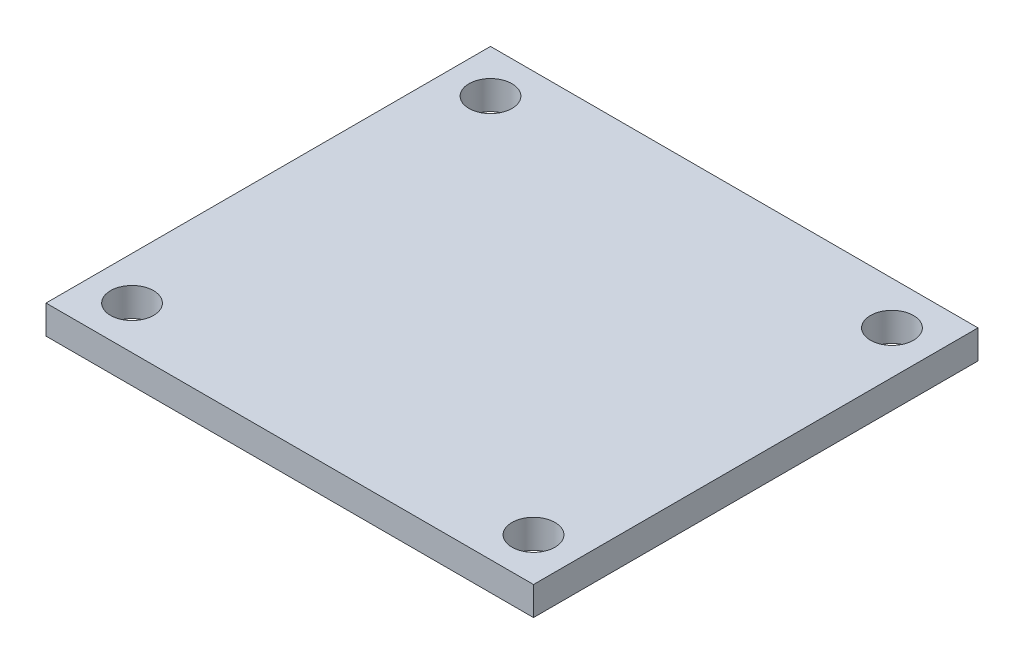
ISO-10303-21;
HEADER;
FILE_DESCRIPTION(('STEP AP214'),'2;1');
FILE_NAME('part.step','',(''),(''),'','','');
FILE_SCHEMA(('AUTOMOTIVE_DESIGN { 1 0 10303 214 1 1 1 1 }'));
ENDSEC;
DATA;
#1=APPLICATION_CONTEXT('core data for automotive mechanical design processes');
#2=APPLICATION_PROTOCOL_DEFINITION('international standard','automotive_design',2000,#1);
#3=PRODUCT_CONTEXT('',#1,'mechanical');
#4=PRODUCT('Part','Part','',(#3));
#5=PRODUCT_RELATED_PRODUCT_CATEGORY('part','',(#4));
#6=PRODUCT_DEFINITION_FORMATION('','',#4);
#7=PRODUCT_DEFINITION_CONTEXT('part definition',#1,'design');
#8=PRODUCT_DEFINITION('design','',#6,#7);
#9=PRODUCT_DEFINITION_SHAPE('','',#8);
#10=(LENGTH_UNIT() NAMED_UNIT(*) SI_UNIT(.MILLI.,.METRE.));
#11=(NAMED_UNIT(*) PLANE_ANGLE_UNIT() SI_UNIT($,.RADIAN.));
#12=(NAMED_UNIT(*) SI_UNIT($,.STERADIAN.) SOLID_ANGLE_UNIT());
#13=UNCERTAINTY_MEASURE_WITH_UNIT(LENGTH_MEASURE(1.E-05),#10,'distance_accuracy_value','');
#14=(GEOMETRIC_REPRESENTATION_CONTEXT(3) GLOBAL_UNCERTAINTY_ASSIGNED_CONTEXT((#13)) GLOBAL_UNIT_ASSIGNED_CONTEXT((#10,
#11,#12)) REPRESENTATION_CONTEXT('',''));
#15=CARTESIAN_POINT('',(0.,0.,0.));
#16=DIRECTION('',(0.,0.,1.));
#17=DIRECTION('',(1.,0.,0.));
#18=AXIS2_PLACEMENT_3D('',#15,#16,#17);
#19=CARTESIAN_POINT('',(0.,2.,0.));
#20=DIRECTION('',(0.,-1.,0.));
#21=DIRECTION('',(0.,0.,-1.));
#22=AXIS2_PLACEMENT_3D('',#19,#20,#21);
#23=PLANE('',#22);
#24=DIRECTION('',(0.,0.,1.));
#25=VECTOR('',#24,1.);
#26=CARTESIAN_POINT('',(0.,2.,0.));
#27=LINE('',#26,#25);
#28=CARTESIAN_POINT('',(0.,2.,-31.0000000000001));
#29=VERTEX_POINT('',#28);
#30=CARTESIAN_POINT('',(0.,2.,0.));
#31=VERTEX_POINT('',#30);
#32=EDGE_CURVE('E85',#29,#31,#27,.T.);
#33=ORIENTED_EDGE('',*,*,#32,.T.);
#34=DIRECTION('',(1.,0.,0.));
#35=VECTOR('',#34,1.);
#36=CARTESIAN_POINT('',(0.,2.,0.));
#37=LINE('',#36,#35);
#38=CARTESIAN_POINT('',(33.9999999999999,2.,0.));
#39=VERTEX_POINT('',#38);
#40=EDGE_CURVE('E80',#31,#39,#37,.T.);
#41=ORIENTED_EDGE('',*,*,#40,.T.);
#42=DIRECTION('',(0.,0.,-1.));
#43=VECTOR('',#42,1.);
#44=CARTESIAN_POINT('',(33.9999999999999,2.,0.));
#45=LINE('',#44,#43);
#46=CARTESIAN_POINT('',(34.,2.,-31.));
#47=VERTEX_POINT('',#46);
#48=EDGE_CURVE('E83',#39,#47,#45,.T.);
#49=ORIENTED_EDGE('',*,*,#48,.T.);
#50=DIRECTION('',(-1.,0.,0.));
#51=VECTOR('',#50,1.);
#52=CARTESIAN_POINT('',(0.,2.,-31.0000000000001));
#53=LINE('',#52,#51);
#54=EDGE_CURVE('E50',#47,#29,#53,.T.);
#55=ORIENTED_EDGE('',*,*,#54,.T.);
#56=EDGE_LOOP('',(#33,#41,#49,#55));
#57=FACE_BOUND('',#56,.T.);
#58=CARTESIAN_POINT('',(3.,2.,-28.));
#59=DIRECTION('',(0.,1.,0.));
#60=DIRECTION('',(0.,0.,1.));
#61=AXIS2_PLACEMENT_3D('',#58,#59,#60);
#62=CIRCLE('',#61,1.5);
#63=CARTESIAN_POINT('',(3.,2.,-26.5));
#64=VERTEX_POINT('',#63);
#65=EDGE_CURVE('E100',#64,#64,#62,.T.);
#66=ORIENTED_EDGE('',*,*,#65,.F.);
#67=EDGE_LOOP('',(#66));
#68=FACE_BOUND('',#67,.T.);
#69=CARTESIAN_POINT('',(31.,2.,-28.));
#70=DIRECTION('',(0.,1.,0.));
#71=DIRECTION('',(0.,0.,-1.));
#72=AXIS2_PLACEMENT_3D('',#69,#70,#71);
#73=CIRCLE('',#72,1.50000000000002);
#74=CARTESIAN_POINT('',(31.,2.,-29.5));
#75=VERTEX_POINT('',#74);
#76=EDGE_CURVE('E115',#75,#75,#73,.T.);
#77=ORIENTED_EDGE('',*,*,#76,.F.);
#78=EDGE_LOOP('',(#77));
#79=FACE_BOUND('',#78,.T.);
#80=CARTESIAN_POINT('',(30.9999999999999,2.,-3.));
#81=DIRECTION('',(0.,1.,0.));
#82=DIRECTION('',(0.,0.,1.));
#83=AXIS2_PLACEMENT_3D('',#80,#81,#82);
#84=CIRCLE('',#83,1.50000000000003);
#85=CARTESIAN_POINT('',(30.9999999999999,2.,-1.49999999999998));
#86=VERTEX_POINT('',#85);
#87=EDGE_CURVE('E121',#86,#86,#84,.T.);
#88=ORIENTED_EDGE('',*,*,#87,.F.);
#89=EDGE_LOOP('',(#88));
#90=FACE_BOUND('',#89,.T.);
#91=CARTESIAN_POINT('',(3.,2.,-3.));
#92=DIRECTION('',(0.,1.,0.));
#93=DIRECTION('',(0.,0.,-1.));
#94=AXIS2_PLACEMENT_3D('',#91,#92,#93);
#95=CIRCLE('',#94,1.5);
#96=CARTESIAN_POINT('',(3.,2.,-4.5));
#97=VERTEX_POINT('',#96);
#98=EDGE_CURVE('E127',#97,#97,#95,.T.);
#99=ORIENTED_EDGE('',*,*,#98,.F.);
#100=EDGE_LOOP('',(#99));
#101=FACE_BOUND('',#100,.T.);
#102=ADVANCED_FACE('F33',(#57,#68,#79,#90,#101),#23,.F.);
#103=CARTESIAN_POINT('',(0.,0.,0.));
#104=DIRECTION('',(0.,-1.,0.));
#105=DIRECTION('',(0.,0.,-1.));
#106=AXIS2_PLACEMENT_3D('',#103,#104,#105);
#107=PLANE('',#106);
#108=CARTESIAN_POINT('',(30.9999999999999,0.,-3.));
#109=DIRECTION('',(0.,1.,0.));
#110=DIRECTION('',(0.,0.,1.));
#111=AXIS2_PLACEMENT_3D('',#108,#109,#110);
#112=CIRCLE('',#111,1.50000000000003);
#113=CARTESIAN_POINT('',(30.9999999999999,0.,-1.49999999999998));
#114=VERTEX_POINT('',#113);
#115=EDGE_CURVE('E124',#114,#114,#112,.T.);
#116=ORIENTED_EDGE('',*,*,#115,.T.);
#117=EDGE_LOOP('',(#116));
#118=FACE_BOUND('',#117,.T.);
#119=CARTESIAN_POINT('',(3.,0.,-28.));
#120=DIRECTION('',(0.,1.,0.));
#121=DIRECTION('',(0.,0.,1.));
#122=AXIS2_PLACEMENT_3D('',#119,#120,#121);
#123=CIRCLE('',#122,1.5);
#124=CARTESIAN_POINT('',(3.,0.,-26.5));
#125=VERTEX_POINT('',#124);
#126=EDGE_CURVE('E112',#125,#125,#123,.T.);
#127=ORIENTED_EDGE('',*,*,#126,.T.);
#128=EDGE_LOOP('',(#127));
#129=FACE_BOUND('',#128,.T.);
#130=DIRECTION('',(0.,0.,1.));
#131=VECTOR('',#130,1.);
#132=CARTESIAN_POINT('',(0.,0.,0.));
#133=LINE('',#132,#131);
#134=CARTESIAN_POINT('',(0.,0.,-31.0000000000001));
#135=VERTEX_POINT('',#134);
#136=CARTESIAN_POINT('',(0.,0.,0.));
#137=VERTEX_POINT('',#136);
#138=EDGE_CURVE('E97',#135,#137,#133,.T.);
#139=ORIENTED_EDGE('',*,*,#138,.F.);
#140=DIRECTION('',(-1.,0.,0.));
#141=VECTOR('',#140,1.);
#142=CARTESIAN_POINT('',(0.,0.,-31.0000000000001));
#143=LINE('',#142,#141);
#144=CARTESIAN_POINT('',(34.,0.,-31.));
#145=VERTEX_POINT('',#144);
#146=EDGE_CURVE('E73',#145,#135,#143,.T.);
#147=ORIENTED_EDGE('',*,*,#146,.F.);
#148=DIRECTION('',(0.,0.,-1.));
#149=VECTOR('',#148,1.);
#150=CARTESIAN_POINT('',(33.9999999999999,0.,0.));
#151=LINE('',#150,#149);
#152=CARTESIAN_POINT('',(33.9999999999999,0.,0.));
#153=VERTEX_POINT('',#152);
#154=EDGE_CURVE('E67',#153,#145,#151,.T.);
#155=ORIENTED_EDGE('',*,*,#154,.F.);
#156=DIRECTION('',(1.,0.,0.));
#157=VECTOR('',#156,1.);
#158=CARTESIAN_POINT('',(0.,0.,0.));
#159=LINE('',#158,#157);
#160=EDGE_CURVE('E89',#137,#153,#159,.T.);
#161=ORIENTED_EDGE('',*,*,#160,.F.);
#162=EDGE_LOOP('',(#139,#147,#155,#161));
#163=FACE_BOUND('',#162,.T.);
#164=CARTESIAN_POINT('',(31.,0.,-28.));
#165=DIRECTION('',(0.,1.,0.));
#166=DIRECTION('',(0.,0.,-1.));
#167=AXIS2_PLACEMENT_3D('',#164,#165,#166);
#168=CIRCLE('',#167,1.50000000000002);
#169=CARTESIAN_POINT('',(31.,0.,-29.5));
#170=VERTEX_POINT('',#169);
#171=EDGE_CURVE('E118',#170,#170,#168,.T.);
#172=ORIENTED_EDGE('',*,*,#171,.T.);
#173=EDGE_LOOP('',(#172));
#174=FACE_BOUND('',#173,.T.);
#175=CARTESIAN_POINT('',(3.,0.,-3.));
#176=DIRECTION('',(0.,1.,0.));
#177=DIRECTION('',(0.,0.,-1.));
#178=AXIS2_PLACEMENT_3D('',#175,#176,#177);
#179=CIRCLE('',#178,1.5);
#180=CARTESIAN_POINT('',(3.,0.,-4.5));
#181=VERTEX_POINT('',#180);
#182=EDGE_CURVE('E130',#181,#181,#179,.T.);
#183=ORIENTED_EDGE('',*,*,#182,.T.);
#184=EDGE_LOOP('',(#183));
#185=FACE_BOUND('',#184,.T.);
#186=ADVANCED_FACE('F108',(#118,#129,#163,#174,#185),#107,.T.);
#187=CARTESIAN_POINT('',(0.,2.,0.));
#188=DIRECTION('',(1.,0.,0.));
#189=DIRECTION('',(0.,0.,-1.));
#190=AXIS2_PLACEMENT_3D('',#187,#188,#189);
#191=PLANE('',#190);
#192=ORIENTED_EDGE('',*,*,#138,.T.);
#193=DIRECTION('',(0.,-1.,0.));
#194=VECTOR('',#193,1.);
#195=CARTESIAN_POINT('',(0.,2.,0.));
#196=LINE('',#195,#194);
#197=EDGE_CURVE('E11',#31,#137,#196,.T.);
#198=ORIENTED_EDGE('',*,*,#197,.F.);
#199=ORIENTED_EDGE('',*,*,#32,.F.);
#200=DIRECTION('',(0.,-1.,0.));
#201=VECTOR('',#200,1.);
#202=CARTESIAN_POINT('',(0.,2.,-31.0000000000001));
#203=LINE('',#202,#201);
#204=EDGE_CURVE('E93',#29,#135,#203,.T.);
#205=ORIENTED_EDGE('',*,*,#204,.T.);
#206=EDGE_LOOP('',(#192,#198,#199,#205));
#207=FACE_BOUND('',#206,.T.);
#208=ADVANCED_FACE('F35',(#207),#191,.F.);
#209=CARTESIAN_POINT('',(0.,2.,0.));
#210=DIRECTION('',(0.,0.,-1.));
#211=DIRECTION('',(-1.,0.,0.));
#212=AXIS2_PLACEMENT_3D('',#209,#210,#211);
#213=PLANE('',#212);
#214=ORIENTED_EDGE('',*,*,#160,.T.);
#215=DIRECTION('',(0.,-1.,0.));
#216=VECTOR('',#215,1.);
#217=CARTESIAN_POINT('',(33.9999999999999,2.,0.));
#218=LINE('',#217,#216);
#219=EDGE_CURVE('E42',#39,#153,#218,.T.);
#220=ORIENTED_EDGE('',*,*,#219,.F.);
#221=ORIENTED_EDGE('',*,*,#40,.F.);
#222=ORIENTED_EDGE('',*,*,#197,.T.);
#223=EDGE_LOOP('',(#214,#220,#221,#222));
#224=FACE_BOUND('',#223,.T.);
#225=ADVANCED_FACE('F88',(#224),#213,.F.);
#226=CARTESIAN_POINT('',(33.9999999999999,2.,0.));
#227=DIRECTION('',(-1.,0.,0.));
#228=DIRECTION('',(0.,0.,1.));
#229=AXIS2_PLACEMENT_3D('',#226,#227,#228);
#230=PLANE('',#229);
#231=ORIENTED_EDGE('',*,*,#154,.T.);
#232=DIRECTION('',(0.,-1.,0.));
#233=VECTOR('',#232,1.);
#234=CARTESIAN_POINT('',(34.,2.,-31.));
#235=LINE('',#234,#233);
#236=EDGE_CURVE('E90',#47,#145,#235,.T.);
#237=ORIENTED_EDGE('',*,*,#236,.F.);
#238=ORIENTED_EDGE('',*,*,#48,.F.);
#239=ORIENTED_EDGE('',*,*,#219,.T.);
#240=EDGE_LOOP('',(#231,#237,#238,#239));
#241=FACE_BOUND('',#240,.T.);
#242=ADVANCED_FACE('F91',(#241),#230,.F.);
#243=CARTESIAN_POINT('',(0.,2.,-31.0000000000001));
#244=DIRECTION('',(0.,0.,1.));
#245=DIRECTION('',(1.,0.,0.));
#246=AXIS2_PLACEMENT_3D('',#243,#244,#245);
#247=PLANE('',#246);
#248=ORIENTED_EDGE('',*,*,#146,.T.);
#249=ORIENTED_EDGE('',*,*,#204,.F.);
#250=ORIENTED_EDGE('',*,*,#54,.F.);
#251=ORIENTED_EDGE('',*,*,#236,.T.);
#252=EDGE_LOOP('',(#248,#249,#250,#251));
#253=FACE_BOUND('',#252,.T.);
#254=ADVANCED_FACE('F105',(#253),#247,.F.);
#255=CARTESIAN_POINT('',(3.,2.,-28.));
#256=DIRECTION('',(0.,-1.,0.));
#257=DIRECTION('',(0.,0.,-1.));
#258=AXIS2_PLACEMENT_3D('',#255,#256,#257);
#259=CYLINDRICAL_SURFACE('',#258,1.5);
#260=ORIENTED_EDGE('',*,*,#65,.T.);
#261=EDGE_LOOP('',(#260));
#262=FACE_BOUND('',#261,.T.);
#263=ORIENTED_EDGE('',*,*,#126,.F.);
#264=EDGE_LOOP('',(#263));
#265=FACE_BOUND('',#264,.T.);
#266=ADVANCED_FACE('F147',(#262,#265),#259,.F.);
#267=CARTESIAN_POINT('',(31.,2.,-28.));
#268=DIRECTION('',(0.,-1.,0.));
#269=DIRECTION('',(0.,0.,-1.));
#270=AXIS2_PLACEMENT_3D('',#267,#268,#269);
#271=CYLINDRICAL_SURFACE('',#270,1.50000000000002);
#272=ORIENTED_EDGE('',*,*,#76,.T.);
#273=EDGE_LOOP('',(#272));
#274=FACE_BOUND('',#273,.T.);
#275=ORIENTED_EDGE('',*,*,#171,.F.);
#276=EDGE_LOOP('',(#275));
#277=FACE_BOUND('',#276,.T.);
#278=ADVANCED_FACE('F193',(#274,#277),#271,.F.);
#279=CARTESIAN_POINT('',(30.9999999999999,2.,-3.));
#280=DIRECTION('',(0.,-1.,0.));
#281=DIRECTION('',(0.,0.,-1.));
#282=AXIS2_PLACEMENT_3D('',#279,#280,#281);
#283=CYLINDRICAL_SURFACE('',#282,1.50000000000003);
#284=ORIENTED_EDGE('',*,*,#87,.T.);
#285=EDGE_LOOP('',(#284));
#286=FACE_BOUND('',#285,.T.);
#287=ORIENTED_EDGE('',*,*,#115,.F.);
#288=EDGE_LOOP('',(#287));
#289=FACE_BOUND('',#288,.T.);
#290=ADVANCED_FACE('F201',(#286,#289),#283,.F.);
#291=CARTESIAN_POINT('',(3.,2.,-3.));
#292=DIRECTION('',(0.,-1.,0.));
#293=DIRECTION('',(0.,0.,-1.));
#294=AXIS2_PLACEMENT_3D('',#291,#292,#293);
#295=CYLINDRICAL_SURFACE('',#294,1.5);
#296=ORIENTED_EDGE('',*,*,#98,.T.);
#297=EDGE_LOOP('',(#296));
#298=FACE_BOUND('',#297,.T.);
#299=ORIENTED_EDGE('',*,*,#182,.F.);
#300=EDGE_LOOP('',(#299));
#301=FACE_BOUND('',#300,.T.);
#302=ADVANCED_FACE('F136',(#298,#301),#295,.F.);
#303=CLOSED_SHELL('',(#102,#186,#208,#225,#242,#254,#266,#278,#290,#302));
#304=MANIFOLD_SOLID_BREP('B2',#303);
#305=ADVANCED_BREP_SHAPE_REPRESENTATION('',(#18,#304),#14);
#306=SHAPE_DEFINITION_REPRESENTATION(#9,#305);
ENDSEC;
END-ISO-10303-21;
